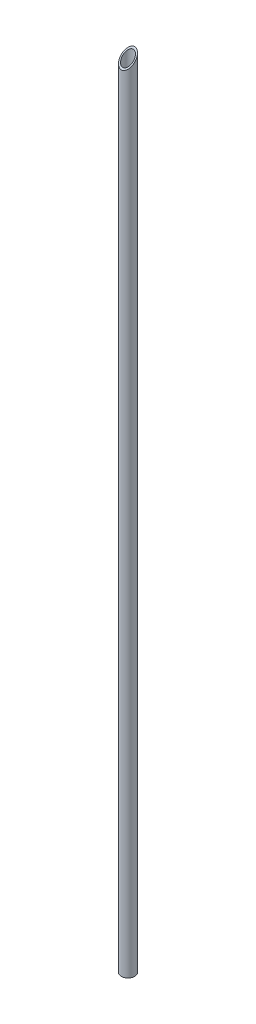
ISO-10303-21;
HEADER;
FILE_DESCRIPTION(('STEP AP214'),'2;1');
FILE_NAME('part.step','',(''),(''),'','','');
FILE_SCHEMA(('AUTOMOTIVE_DESIGN { 1 0 10303 214 1 1 1 1 }'));
ENDSEC;
DATA;
#1=APPLICATION_CONTEXT('core data for automotive mechanical design processes');
#2=APPLICATION_PROTOCOL_DEFINITION('international standard','automotive_design',2000,#1);
#3=PRODUCT_CONTEXT('',#1,'mechanical');
#4=PRODUCT('Part','Part','',(#3));
#5=PRODUCT_RELATED_PRODUCT_CATEGORY('part','',(#4));
#6=PRODUCT_DEFINITION_FORMATION('','',#4);
#7=PRODUCT_DEFINITION_CONTEXT('part definition',#1,'design');
#8=PRODUCT_DEFINITION('design','',#6,#7);
#9=PRODUCT_DEFINITION_SHAPE('','',#8);
#10=(LENGTH_UNIT() NAMED_UNIT(*) SI_UNIT(.MILLI.,.METRE.));
#11=(NAMED_UNIT(*) PLANE_ANGLE_UNIT() SI_UNIT($,.RADIAN.));
#12=(NAMED_UNIT(*) SI_UNIT($,.STERADIAN.) SOLID_ANGLE_UNIT());
#13=UNCERTAINTY_MEASURE_WITH_UNIT(LENGTH_MEASURE(1.E-05),#10,'distance_accuracy_value','');
#14=(GEOMETRIC_REPRESENTATION_CONTEXT(3) GLOBAL_UNCERTAINTY_ASSIGNED_CONTEXT((#13)) GLOBAL_UNIT_ASSIGNED_CONTEXT((#10,
#11,#12)) REPRESENTATION_CONTEXT('',''));
#15=CARTESIAN_POINT('',(0.,0.,0.));
#16=DIRECTION('',(0.,0.,1.));
#17=DIRECTION('',(1.,0.,0.));
#18=AXIS2_PLACEMENT_3D('',#15,#16,#17);
#19=CARTESIAN_POINT('',(0.,0.,0.));
#20=DIRECTION('',(0.,1.,0.));
#21=DIRECTION('',(0.,0.,1.));
#22=AXIS2_PLACEMENT_3D('',#19,#20,#21);
#23=CYLINDRICAL_SURFACE('',#22,13.0683);
#24=CARTESIAN_POINT('',(0.,0.,0.));
#25=DIRECTION('',(0.,1.,0.));
#26=DIRECTION('',(0.,0.,1.));
#27=AXIS2_PLACEMENT_3D('',#24,#25,#26);
#28=CIRCLE('',#27,13.0683);
#29=CARTESIAN_POINT('',(0.,0.,13.0683));
#30=VERTEX_POINT('',#29);
#31=EDGE_CURVE('E17',#30,#30,#28,.F.);
#32=ORIENTED_EDGE('',*,*,#31,.T.);
#33=EDGE_LOOP('',(#32));
#34=FACE_BOUND('',#33,.T.);
#35=CARTESIAN_POINT('',(0.,1964.4995,0.));
#36=DIRECTION('',(0.,-0.707106781186548,-0.707106781186548));
#37=DIRECTION('',(0.,0.707106781186548,-0.707106781186548));
#38=AXIS2_PLACEMENT_3D('',#35,#36,#37);
#39=ELLIPSE('',#38,18.4813670971603,13.0683);
#40=CARTESIAN_POINT('',(0.,1977.5678,-13.0683));
#41=VERTEX_POINT('',#40);
#42=EDGE_CURVE('E26',#41,#41,#39,.F.);
#43=ORIENTED_EDGE('',*,*,#42,.T.);
#44=EDGE_LOOP('',(#43));
#45=FACE_BOUND('',#44,.T.);
#46=ADVANCED_FACE('F14',(#34,#45),#23,.F.);
#47=CARTESIAN_POINT('',(0.,0.,0.));
#48=DIRECTION('',(0.,1.,0.));
#49=DIRECTION('',(0.,0.,1.));
#50=AXIS2_PLACEMENT_3D('',#47,#48,#49);
#51=PLANE('',#50);
#52=ORIENTED_EDGE('',*,*,#31,.F.);
#53=EDGE_LOOP('',(#52));
#54=FACE_BOUND('',#53,.T.);
#55=CARTESIAN_POINT('',(0.,0.,0.));
#56=DIRECTION('',(0.,1.,0.));
#57=DIRECTION('',(0.,0.,1.));
#58=AXIS2_PLACEMENT_3D('',#55,#56,#57);
#59=CIRCLE('',#58,16.7005);
#60=CARTESIAN_POINT('',(0.,0.,16.7005));
#61=VERTEX_POINT('',#60);
#62=EDGE_CURVE('E21',#61,#61,#59,.T.);
#63=ORIENTED_EDGE('',*,*,#62,.F.);
#64=EDGE_LOOP('',(#63));
#65=FACE_BOUND('',#64,.T.);
#66=ADVANCED_FACE('F35',(#54,#65),#51,.F.);
#67=CARTESIAN_POINT('',(-247.7008,1947.799,16.7005));
#68=DIRECTION('',(0.,-0.707106781186548,-0.707106781186548));
#69=DIRECTION('',(0.,0.707106781186548,-0.707106781186548));
#70=AXIS2_PLACEMENT_3D('',#67,#68,#69);
#71=PLANE('',#70);
#72=ORIENTED_EDGE('',*,*,#42,.F.);
#73=EDGE_LOOP('',(#72));
#74=FACE_BOUND('',#73,.T.);
#75=CARTESIAN_POINT('',(0.,1964.4995,0.));
#76=DIRECTION('',(0.,-0.707106781186548,-0.707106781186548));
#77=DIRECTION('',(0.,0.707106781186548,-0.707106781186548));
#78=AXIS2_PLACEMENT_3D('',#75,#76,#77);
#79=ELLIPSE('',#78,23.6180735984119,16.7005);
#80=CARTESIAN_POINT('',(0.,1981.2,-16.7005));
#81=VERTEX_POINT('',#80);
#82=EDGE_CURVE('E10',#81,#81,#79,.T.);
#83=ORIENTED_EDGE('',*,*,#82,.F.);
#84=EDGE_LOOP('',(#83));
#85=FACE_BOUND('',#84,.T.);
#86=ADVANCED_FACE('F38',(#74,#85),#71,.F.);
#87=CARTESIAN_POINT('',(0.,0.,0.));
#88=DIRECTION('',(0.,1.,0.));
#89=DIRECTION('',(0.,0.,1.));
#90=AXIS2_PLACEMENT_3D('',#87,#88,#89);
#91=CYLINDRICAL_SURFACE('',#90,16.7005);
#92=ORIENTED_EDGE('',*,*,#62,.T.);
#93=EDGE_LOOP('',(#92));
#94=FACE_BOUND('',#93,.T.);
#95=ORIENTED_EDGE('',*,*,#82,.T.);
#96=EDGE_LOOP('',(#95));
#97=FACE_BOUND('',#96,.T.);
#98=ADVANCED_FACE('F41',(#94,#97),#91,.T.);
#99=CLOSED_SHELL('',(#46,#66,#86,#98));
#100=MANIFOLD_SOLID_BREP('B1',#99);
#101=ADVANCED_BREP_SHAPE_REPRESENTATION('',(#18,#100),#14);
#102=SHAPE_DEFINITION_REPRESENTATION(#9,#101);
ENDSEC;
END-ISO-10303-21;
